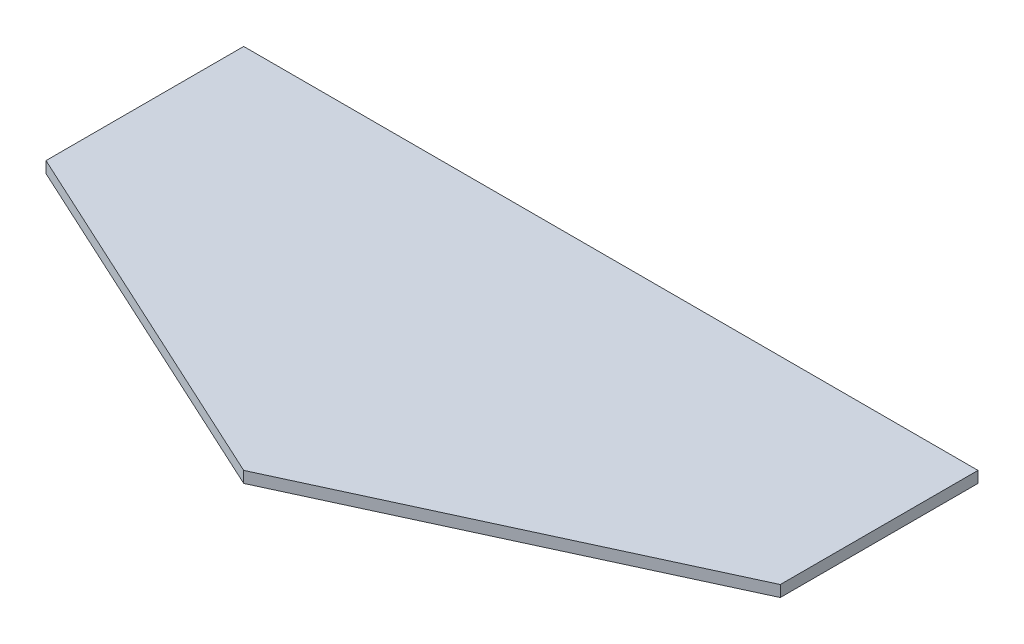
ISO-10303-21;
HEADER;
FILE_DESCRIPTION(('STEP AP214'),'2;1');
FILE_NAME('part.step','',(''),(''),'','','');
FILE_SCHEMA(('AUTOMOTIVE_DESIGN { 1 0 10303 214 1 1 1 1 }'));
ENDSEC;
DATA;
#1=APPLICATION_CONTEXT('core data for automotive mechanical design processes');
#2=APPLICATION_PROTOCOL_DEFINITION('international standard','automotive_design',2000,#1);
#3=PRODUCT_CONTEXT('',#1,'mechanical');
#4=PRODUCT('Part','Part','',(#3));
#5=PRODUCT_RELATED_PRODUCT_CATEGORY('part','',(#4));
#6=PRODUCT_DEFINITION_FORMATION('','',#4);
#7=PRODUCT_DEFINITION_CONTEXT('part definition',#1,'design');
#8=PRODUCT_DEFINITION('design','',#6,#7);
#9=PRODUCT_DEFINITION_SHAPE('','',#8);
#10=(LENGTH_UNIT() NAMED_UNIT(*) SI_UNIT(.MILLI.,.METRE.));
#11=(NAMED_UNIT(*) PLANE_ANGLE_UNIT() SI_UNIT($,.RADIAN.));
#12=(NAMED_UNIT(*) SI_UNIT($,.STERADIAN.) SOLID_ANGLE_UNIT());
#13=UNCERTAINTY_MEASURE_WITH_UNIT(LENGTH_MEASURE(1.E-05),#10,'distance_accuracy_value','');
#14=(GEOMETRIC_REPRESENTATION_CONTEXT(3) GLOBAL_UNCERTAINTY_ASSIGNED_CONTEXT((#13)) GLOBAL_UNIT_ASSIGNED_CONTEXT((#10,
#11,#12)) REPRESENTATION_CONTEXT('',''));
#15=CARTESIAN_POINT('',(0.,0.,0.));
#16=DIRECTION('',(0.,0.,1.));
#17=DIRECTION('',(1.,0.,0.));
#18=AXIS2_PLACEMENT_3D('',#15,#16,#17);
#19=CARTESIAN_POINT('',(72.2926829268293,4.,156.634146341463));
#20=DIRECTION('',(-0.419058177461747,0.,-0.907959384500452));
#21=DIRECTION('',(-0.907959384500452,0.,0.419058177461747));
#22=AXIS2_PLACEMENT_3D('',#19,#20,#21);
#23=PLANE('',#22);
#24=DIRECTION('',(0.907959384500452,0.,-0.419058177461747));
#25=VECTOR('',#24,1.);
#26=CARTESIAN_POINT('',(72.2926829268293,0.,156.634146341463));
#27=LINE('',#26,#25);
#28=CARTESIAN_POINT('',(130.,0.,130.));
#29=VERTEX_POINT('',#28);
#30=CARTESIAN_POINT('',(260.,0.,70.));
#31=VERTEX_POINT('',#30);
#32=EDGE_CURVE('E110',#29,#31,#27,.T.);
#33=ORIENTED_EDGE('',*,*,#32,.T.);
#34=DIRECTION('',(0.,-1.,0.));
#35=VECTOR('',#34,1.);
#36=CARTESIAN_POINT('',(260.,4.,70.));
#37=LINE('',#36,#35);
#38=CARTESIAN_POINT('',(260.,4.,70.));
#39=VERTEX_POINT('',#38);
#40=EDGE_CURVE('E11',#39,#31,#37,.T.);
#41=ORIENTED_EDGE('',*,*,#40,.F.);
#42=DIRECTION('',(0.907959384500452,0.,-0.419058177461747));
#43=VECTOR('',#42,1.);
#44=CARTESIAN_POINT('',(72.2926829268293,4.,156.634146341463));
#45=LINE('',#44,#43);
#46=CARTESIAN_POINT('',(130.,4.,130.));
#47=VERTEX_POINT('',#46);
#48=EDGE_CURVE('E81',#47,#39,#45,.T.);
#49=ORIENTED_EDGE('',*,*,#48,.F.);
#50=DIRECTION('',(0.,-1.,0.));
#51=VECTOR('',#50,1.);
#52=CARTESIAN_POINT('',(130.,4.,130.));
#53=LINE('',#52,#51);
#54=EDGE_CURVE('E109',#47,#29,#53,.T.);
#55=ORIENTED_EDGE('',*,*,#54,.T.);
#56=EDGE_LOOP('',(#33,#41,#49,#55));
#57=FACE_BOUND('',#56,.T.);
#58=ADVANCED_FACE('F35',(#57),#23,.F.);
#59=CARTESIAN_POINT('',(260.,4.,0.));
#60=DIRECTION('',(1.,0.,0.));
#61=DIRECTION('',(0.,0.,-1.));
#62=AXIS2_PLACEMENT_3D('',#59,#60,#61);
#63=PLANE('',#62);
#64=DIRECTION('',(0.,0.,1.));
#65=VECTOR('',#64,1.);
#66=CARTESIAN_POINT('',(260.,0.,0.));
#67=LINE('',#66,#65);
#68=CARTESIAN_POINT('',(260.,0.,0.));
#69=VERTEX_POINT('',#68);
#70=EDGE_CURVE('E113',#69,#31,#67,.T.);
#71=ORIENTED_EDGE('',*,*,#70,.F.);
#72=DIRECTION('',(0.,-1.,0.));
#73=VECTOR('',#72,1.);
#74=CARTESIAN_POINT('',(260.,4.,0.));
#75=LINE('',#74,#73);
#76=CARTESIAN_POINT('',(260.,4.,0.));
#77=VERTEX_POINT('',#76);
#78=EDGE_CURVE('E43',#77,#69,#75,.T.);
#79=ORIENTED_EDGE('',*,*,#78,.F.);
#80=DIRECTION('',(0.,0.,1.));
#81=VECTOR('',#80,1.);
#82=CARTESIAN_POINT('',(260.,4.,0.));
#83=LINE('',#82,#81);
#84=EDGE_CURVE('E103',#77,#39,#83,.T.);
#85=ORIENTED_EDGE('',*,*,#84,.T.);
#86=ORIENTED_EDGE('',*,*,#40,.T.);
#87=EDGE_LOOP('',(#71,#79,#85,#86));
#88=FACE_BOUND('',#87,.T.);
#89=ADVANCED_FACE('F122',(#88),#63,.T.);
#90=CARTESIAN_POINT('',(0.,4.,0.));
#91=DIRECTION('',(0.,0.,-1.));
#92=DIRECTION('',(-1.,0.,0.));
#93=AXIS2_PLACEMENT_3D('',#90,#91,#92);
#94=PLANE('',#93);
#95=DIRECTION('',(1.,0.,0.));
#96=VECTOR('',#95,1.);
#97=CARTESIAN_POINT('',(0.,0.,0.));
#98=LINE('',#97,#96);
#99=CARTESIAN_POINT('',(0.,0.,0.));
#100=VERTEX_POINT('',#99);
#101=EDGE_CURVE('E95',#100,#69,#98,.T.);
#102=ORIENTED_EDGE('',*,*,#101,.F.);
#103=DIRECTION('',(0.,-1.,0.));
#104=VECTOR('',#103,1.);
#105=CARTESIAN_POINT('',(0.,4.,0.));
#106=LINE('',#105,#104);
#107=CARTESIAN_POINT('',(0.,4.,0.));
#108=VERTEX_POINT('',#107);
#109=EDGE_CURVE('E89',#108,#100,#106,.T.);
#110=ORIENTED_EDGE('',*,*,#109,.F.);
#111=DIRECTION('',(1.,0.,0.));
#112=VECTOR('',#111,1.);
#113=CARTESIAN_POINT('',(0.,4.,0.));
#114=LINE('',#113,#112);
#115=EDGE_CURVE('E93',#108,#77,#114,.T.);
#116=ORIENTED_EDGE('',*,*,#115,.T.);
#117=ORIENTED_EDGE('',*,*,#78,.T.);
#118=EDGE_LOOP('',(#102,#110,#116,#117));
#119=FACE_BOUND('',#118,.T.);
#120=ADVANCED_FACE('F91',(#119),#94,.T.);
#121=CARTESIAN_POINT('',(0.,4.,0.));
#122=DIRECTION('',(1.,0.,0.));
#123=DIRECTION('',(0.,0.,-1.));
#124=AXIS2_PLACEMENT_3D('',#121,#122,#123);
#125=PLANE('',#124);
#126=DIRECTION('',(0.,0.,1.));
#127=VECTOR('',#126,1.);
#128=CARTESIAN_POINT('',(0.,0.,0.));
#129=LINE('',#128,#127);
#130=CARTESIAN_POINT('',(0.,0.,70.));
#131=VERTEX_POINT('',#130);
#132=EDGE_CURVE('E69',#100,#131,#129,.T.);
#133=ORIENTED_EDGE('',*,*,#132,.T.);
#134=DIRECTION('',(0.,-1.,0.));
#135=VECTOR('',#134,1.);
#136=CARTESIAN_POINT('',(0.,4.,70.));
#137=LINE('',#136,#135);
#138=CARTESIAN_POINT('',(0.,4.,70.));
#139=VERTEX_POINT('',#138);
#140=EDGE_CURVE('E96',#139,#131,#137,.T.);
#141=ORIENTED_EDGE('',*,*,#140,.F.);
#142=DIRECTION('',(0.,0.,1.));
#143=VECTOR('',#142,1.);
#144=CARTESIAN_POINT('',(0.,4.,0.));
#145=LINE('',#144,#143);
#146=EDGE_CURVE('E98',#108,#139,#145,.T.);
#147=ORIENTED_EDGE('',*,*,#146,.F.);
#148=ORIENTED_EDGE('',*,*,#109,.T.);
#149=EDGE_LOOP('',(#133,#141,#147,#148));
#150=FACE_BOUND('',#149,.T.);
#151=ADVANCED_FACE('F99',(#150),#125,.F.);
#152=CARTESIAN_POINT('',(-26.6341463414634,4.,57.7073170731707));
#153=DIRECTION('',(0.419058177461747,0.,-0.907959384500452));
#154=DIRECTION('',(-0.907959384500452,0.,-0.419058177461747));
#155=AXIS2_PLACEMENT_3D('',#152,#153,#154);
#156=PLANE('',#155);
#157=DIRECTION('',(0.907959384500452,0.,0.419058177461747));
#158=VECTOR('',#157,1.);
#159=CARTESIAN_POINT('',(-26.6341463414634,0.,57.7073170731707));
#160=LINE('',#159,#158);
#161=EDGE_CURVE('E75',#131,#29,#160,.T.);
#162=ORIENTED_EDGE('',*,*,#161,.T.);
#163=ORIENTED_EDGE('',*,*,#54,.F.);
#164=DIRECTION('',(0.907959384500452,0.,0.419058177461747));
#165=VECTOR('',#164,1.);
#166=CARTESIAN_POINT('',(-26.6341463414634,4.,57.7073170731707));
#167=LINE('',#166,#165);
#168=EDGE_CURVE('E51',#139,#47,#167,.T.);
#169=ORIENTED_EDGE('',*,*,#168,.F.);
#170=ORIENTED_EDGE('',*,*,#140,.T.);
#171=EDGE_LOOP('',(#162,#163,#169,#170));
#172=FACE_BOUND('',#171,.T.);
#173=ADVANCED_FACE('F127',(#172),#156,.F.);
#174=CARTESIAN_POINT('',(0.,4.,0.));
#175=DIRECTION('',(0.,1.,0.));
#176=DIRECTION('',(0.,0.,1.));
#177=AXIS2_PLACEMENT_3D('',#174,#175,#176);
#178=PLANE('',#177);
#179=ORIENTED_EDGE('',*,*,#48,.T.);
#180=ORIENTED_EDGE('',*,*,#84,.F.);
#181=ORIENTED_EDGE('',*,*,#115,.F.);
#182=ORIENTED_EDGE('',*,*,#146,.T.);
#183=ORIENTED_EDGE('',*,*,#168,.T.);
#184=EDGE_LOOP('',(#179,#180,#181,#182,#183));
#185=FACE_BOUND('',#184,.T.);
#186=ADVANCED_FACE('F101',(#185),#178,.T.);
#187=CARTESIAN_POINT('',(0.,0.,0.));
#188=DIRECTION('',(0.,1.,0.));
#189=DIRECTION('',(0.,0.,1.));
#190=AXIS2_PLACEMENT_3D('',#187,#188,#189);
#191=PLANE('',#190);
#192=ORIENTED_EDGE('',*,*,#32,.F.);
#193=ORIENTED_EDGE('',*,*,#161,.F.);
#194=ORIENTED_EDGE('',*,*,#132,.F.);
#195=ORIENTED_EDGE('',*,*,#101,.T.);
#196=ORIENTED_EDGE('',*,*,#70,.T.);
#197=EDGE_LOOP('',(#192,#193,#194,#195,#196));
#198=FACE_BOUND('',#197,.T.);
#199=ADVANCED_FACE('F125',(#198),#191,.F.);
#200=CLOSED_SHELL('',(#58,#89,#120,#151,#173,#186,#199));
#201=MANIFOLD_SOLID_BREP('B2',#200);
#202=ADVANCED_BREP_SHAPE_REPRESENTATION('',(#18,#201),#14);
#203=SHAPE_DEFINITION_REPRESENTATION(#9,#202);
ENDSEC;
END-ISO-10303-21;
